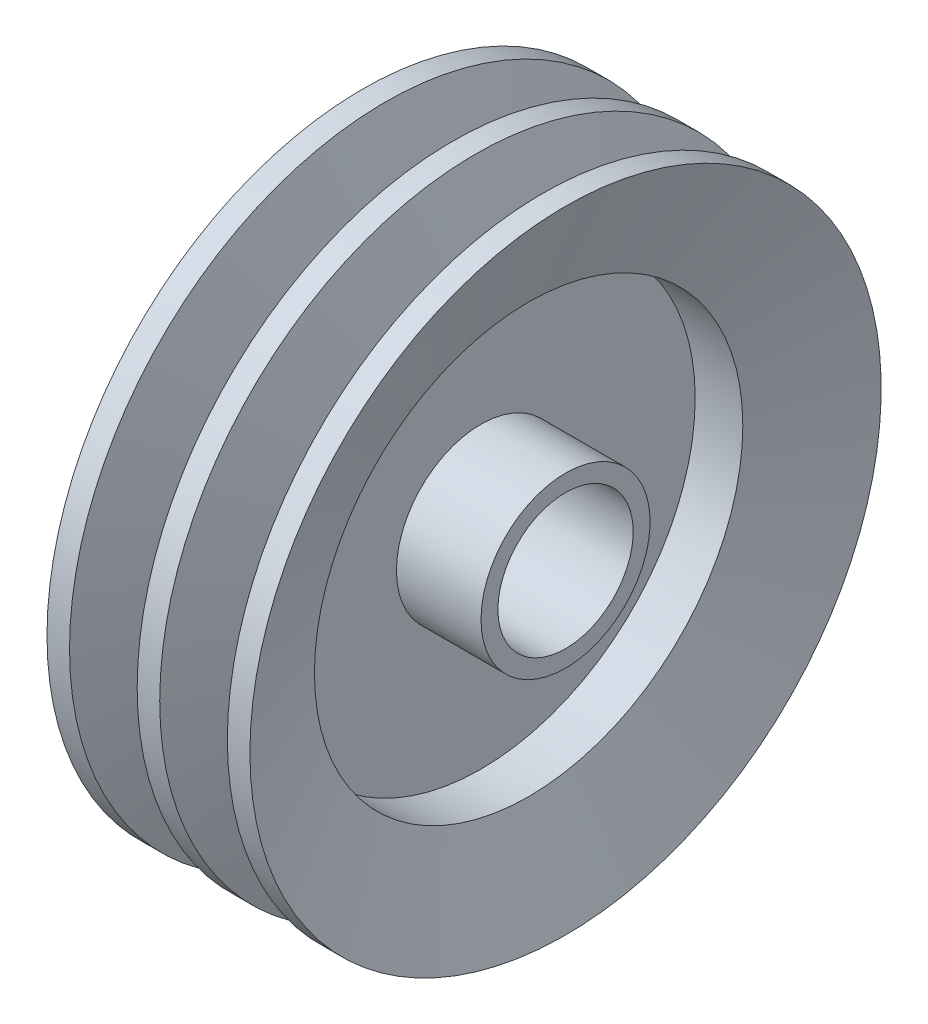
ISO-10303-21;
HEADER;
FILE_DESCRIPTION(('STEP AP214'),'2;1');
FILE_NAME('part.step','',(''),(''),'','','');
FILE_SCHEMA(('AUTOMOTIVE_DESIGN { 1 0 10303 214 1 1 1 1 }'));
ENDSEC;
DATA;
#1=APPLICATION_CONTEXT('core data for automotive mechanical design processes');
#2=APPLICATION_PROTOCOL_DEFINITION('international standard','automotive_design',2000,#1);
#3=PRODUCT_CONTEXT('',#1,'mechanical');
#4=PRODUCT('Part','Part','',(#3));
#5=PRODUCT_RELATED_PRODUCT_CATEGORY('part','',(#4));
#6=PRODUCT_DEFINITION_FORMATION('','',#4);
#7=PRODUCT_DEFINITION_CONTEXT('part definition',#1,'design');
#8=PRODUCT_DEFINITION('design','',#6,#7);
#9=PRODUCT_DEFINITION_SHAPE('','',#8);
#10=(LENGTH_UNIT() NAMED_UNIT(*) SI_UNIT(.MILLI.,.METRE.));
#11=(NAMED_UNIT(*) PLANE_ANGLE_UNIT() SI_UNIT($,.RADIAN.));
#12=(NAMED_UNIT(*) SI_UNIT($,.STERADIAN.) SOLID_ANGLE_UNIT());
#13=UNCERTAINTY_MEASURE_WITH_UNIT(LENGTH_MEASURE(1.E-05),#10,'distance_accuracy_value','');
#14=(GEOMETRIC_REPRESENTATION_CONTEXT(3) GLOBAL_UNCERTAINTY_ASSIGNED_CONTEXT((#13)) GLOBAL_UNIT_ASSIGNED_CONTEXT((#10,
#11,#12)) REPRESENTATION_CONTEXT('',''));
#15=CARTESIAN_POINT('',(0.,0.,0.));
#16=DIRECTION('',(0.,0.,1.));
#17=DIRECTION('',(1.,0.,0.));
#18=AXIS2_PLACEMENT_3D('',#15,#16,#17);
#19=CARTESIAN_POINT('',(-45.,0.,-7.5));
#20=DIRECTION('',(1.,0.,0.));
#21=DIRECTION('',(0.,0.,-1.));
#22=AXIS2_PLACEMENT_3D('',#19,#20,#21);
#23=PLANE('',#22);
#24=CARTESIAN_POINT('',(-45.,0.,30.));
#25=DIRECTION('',(-1.,0.,0.));
#26=DIRECTION('',(0.,0.,1.));
#27=AXIS2_PLACEMENT_3D('',#24,#25,#26);
#28=CIRCLE('',#27,30.);
#29=CARTESIAN_POINT('',(-45.,0.,60.));
#30=VERTEX_POINT('',#29);
#31=EDGE_CURVE('E101',#30,#30,#28,.T.);
#32=ORIENTED_EDGE('',*,*,#31,.F.);
#33=EDGE_LOOP('',(#32));
#34=FACE_BOUND('',#33,.T.);
#35=CARTESIAN_POINT('',(-45.,0.,30.));
#36=DIRECTION('',(-1.,0.,0.));
#37=DIRECTION('',(0.,0.,1.));
#38=AXIS2_PLACEMENT_3D('',#35,#36,#37);
#39=CIRCLE('',#38,37.5);
#40=CARTESIAN_POINT('',(-45.,0.,67.5));
#41=VERTEX_POINT('',#40);
#42=EDGE_CURVE('E10',#41,#41,#39,.T.);
#43=ORIENTED_EDGE('',*,*,#42,.T.);
#44=EDGE_LOOP('',(#43));
#45=FACE_BOUND('',#44,.T.);
#46=ADVANCED_FACE('F37',(#34,#45),#23,.F.);
#47=CARTESIAN_POINT('',(-45.0000000000001,0.,30.));
#48=DIRECTION('',(-1.,0.,0.));
#49=DIRECTION('',(0.,0.,1.));
#50=AXIS2_PLACEMENT_3D('',#47,#48,#49);
#51=CYLINDRICAL_SURFACE('',#50,37.5);
#52=ORIENTED_EDGE('',*,*,#42,.F.);
#53=EDGE_LOOP('',(#52));
#54=FACE_BOUND('',#53,.T.);
#55=CARTESIAN_POINT('',(-7.50000000000001,0.,30.));
#56=DIRECTION('',(-1.,0.,0.));
#57=DIRECTION('',(0.,0.,1.));
#58=AXIS2_PLACEMENT_3D('',#55,#56,#57);
#59=CIRCLE('',#58,37.5);
#60=CARTESIAN_POINT('',(-7.50000000000002,0.,67.5));
#61=VERTEX_POINT('',#60);
#62=EDGE_CURVE('E43',#61,#61,#59,.T.);
#63=ORIENTED_EDGE('',*,*,#62,.T.);
#64=EDGE_LOOP('',(#63));
#65=FACE_BOUND('',#64,.T.);
#66=ADVANCED_FACE('F108',(#54,#65),#51,.T.);
#67=CARTESIAN_POINT('',(-7.5,0.,-65.));
#68=DIRECTION('',(1.,0.,0.));
#69=DIRECTION('',(0.,0.,-1.));
#70=AXIS2_PLACEMENT_3D('',#67,#68,#69);
#71=PLANE('',#70);
#72=ORIENTED_EDGE('',*,*,#62,.F.);
#73=EDGE_LOOP('',(#72));
#74=FACE_BOUND('',#73,.T.);
#75=CARTESIAN_POINT('',(-7.50000000000002,0.,30.));
#76=DIRECTION('',(-1.,0.,0.));
#77=DIRECTION('',(0.,0.,1.));
#78=AXIS2_PLACEMENT_3D('',#75,#76,#77);
#79=CIRCLE('',#78,95.);
#80=CARTESIAN_POINT('',(-7.50000000000004,0.,125.));
#81=VERTEX_POINT('',#80);
#82=EDGE_CURVE('E47',#81,#81,#79,.T.);
#83=ORIENTED_EDGE('',*,*,#82,.T.);
#84=EDGE_LOOP('',(#83));
#85=FACE_BOUND('',#84,.T.);
#86=ADVANCED_FACE('F112',(#74,#85),#71,.F.);
#87=CARTESIAN_POINT('',(-45.0000000000001,0.,30.));
#88=DIRECTION('',(-1.,0.,0.));
#89=DIRECTION('',(0.,0.,1.));
#90=AXIS2_PLACEMENT_3D('',#87,#88,#89);
#91=CYLINDRICAL_SURFACE('',#90,95.);
#92=ORIENTED_EDGE('',*,*,#82,.F.);
#93=EDGE_LOOP('',(#92));
#94=FACE_BOUND('',#93,.T.);
#95=CARTESIAN_POINT('',(-28.621339458021,0.,30.));
#96=DIRECTION('',(-1.,0.,0.));
#97=DIRECTION('',(0.,0.,1.));
#98=AXIS2_PLACEMENT_3D('',#95,#96,#97);
#99=CIRCLE('',#98,95.);
#100=CARTESIAN_POINT('',(-28.621339458021,0.,125.));
#101=VERTEX_POINT('',#100);
#102=EDGE_CURVE('E51',#101,#101,#99,.T.);
#103=ORIENTED_EDGE('',*,*,#102,.T.);
#104=EDGE_LOOP('',(#103));
#105=FACE_BOUND('',#104,.T.);
#106=ADVANCED_FACE('F117',(#94,#105),#91,.F.);
#107=CARTESIAN_POINT('',(-45.,0.,30.));
#108=DIRECTION('',(-1.,0.,0.));
#109=DIRECTION('',(0.,0.,1.));
#110=AXIS2_PLACEMENT_3D('',#107,#108,#109);
#111=CONICAL_SURFACE('',#110,140.,1.22173047639603);
#112=ORIENTED_EDGE('',*,*,#102,.F.);
#113=EDGE_LOOP('',(#112));
#114=FACE_BOUND('',#113,.T.);
#115=CARTESIAN_POINT('',(-45.,0.,30.));
#116=DIRECTION('',(-1.,0.,0.));
#117=DIRECTION('',(0.,0.,1.));
#118=AXIS2_PLACEMENT_3D('',#115,#116,#117);
#119=CIRCLE('',#118,140.);
#120=CARTESIAN_POINT('',(-45.0000000000001,0.,170.));
#121=VERTEX_POINT('',#120);
#122=EDGE_CURVE('E56',#121,#121,#119,.T.);
#123=ORIENTED_EDGE('',*,*,#122,.T.);
#124=EDGE_LOOP('',(#123));
#125=FACE_BOUND('',#124,.T.);
#126=ADVANCED_FACE('F123',(#114,#125),#111,.F.);
#127=CARTESIAN_POINT('',(-45.0000000000001,0.,30.));
#128=DIRECTION('',(-1.,0.,0.));
#129=DIRECTION('',(0.,0.,1.));
#130=AXIS2_PLACEMENT_3D('',#127,#128,#129);
#131=CYLINDRICAL_SURFACE('',#130,140.);
#132=ORIENTED_EDGE('',*,*,#122,.F.);
#133=EDGE_LOOP('',(#132));
#134=FACE_BOUND('',#133,.T.);
#135=CARTESIAN_POINT('',(-35.,0.,30.));
#136=DIRECTION('',(-1.,0.,0.));
#137=DIRECTION('',(0.,0.,1.));
#138=AXIS2_PLACEMENT_3D('',#135,#136,#137);
#139=CIRCLE('',#138,140.);
#140=CARTESIAN_POINT('',(-35.,0.,170.));
#141=VERTEX_POINT('',#140);
#142=EDGE_CURVE('E59',#141,#141,#139,.T.);
#143=ORIENTED_EDGE('',*,*,#142,.T.);
#144=EDGE_LOOP('',(#143));
#145=FACE_BOUND('',#144,.T.);
#146=ADVANCED_FACE('F127',(#134,#145),#131,.T.);
#147=CARTESIAN_POINT('',(-24.0808929720141,0.,30.));
#148=DIRECTION('',(-1.,0.,0.));
#149=DIRECTION('',(0.,0.,1.));
#150=AXIS2_PLACEMENT_3D('',#147,#148,#149);
#151=CONICAL_SURFACE('',#150,110.,1.22173047639603);
#152=ORIENTED_EDGE('',*,*,#142,.F.);
#153=EDGE_LOOP('',(#152));
#154=FACE_BOUND('',#153,.T.);
#155=CARTESIAN_POINT('',(-24.0808929720141,0.,30.));
#156=DIRECTION('',(-1.,0.,0.));
#157=DIRECTION('',(0.,0.,1.));
#158=AXIS2_PLACEMENT_3D('',#155,#156,#157);
#159=CIRCLE('',#158,110.);
#160=CARTESIAN_POINT('',(-24.0808929720141,0.,140.));
#161=VERTEX_POINT('',#160);
#162=EDGE_CURVE('E62',#161,#161,#159,.T.);
#163=ORIENTED_EDGE('',*,*,#162,.T.);
#164=EDGE_LOOP('',(#163));
#165=FACE_BOUND('',#164,.T.);
#166=ADVANCED_FACE('F131',(#154,#165),#151,.T.);
#167=CARTESIAN_POINT('',(-45.0000000000001,0.,30.));
#168=DIRECTION('',(-1.,0.,0.));
#169=DIRECTION('',(0.,0.,1.));
#170=AXIS2_PLACEMENT_3D('',#167,#168,#169);
#171=CYLINDRICAL_SURFACE('',#170,110.);
#172=ORIENTED_EDGE('',*,*,#162,.F.);
#173=EDGE_LOOP('',(#172));
#174=FACE_BOUND('',#173,.T.);
#175=CARTESIAN_POINT('',(-15.919107027986,0.,30.));
#176=DIRECTION('',(-1.,0.,0.));
#177=DIRECTION('',(0.,0.,1.));
#178=AXIS2_PLACEMENT_3D('',#175,#176,#177);
#179=CIRCLE('',#178,110.);
#180=CARTESIAN_POINT('',(-15.919107027986,0.,140.));
#181=VERTEX_POINT('',#180);
#182=EDGE_CURVE('E65',#181,#181,#179,.T.);
#183=ORIENTED_EDGE('',*,*,#182,.T.);
#184=EDGE_LOOP('',(#183));
#185=FACE_BOUND('',#184,.T.);
#186=ADVANCED_FACE('F135',(#174,#185),#171,.T.);
#187=CARTESIAN_POINT('',(-5.00000000000002,0.,30.));
#188=DIRECTION('',(1.,0.,0.));
#189=DIRECTION('',(0.,0.,-1.));
#190=AXIS2_PLACEMENT_3D('',#187,#188,#189);
#191=CONICAL_SURFACE('',#190,140.,1.22173047639603);
#192=ORIENTED_EDGE('',*,*,#182,.F.);
#193=EDGE_LOOP('',(#192));
#194=FACE_BOUND('',#193,.T.);
#195=CARTESIAN_POINT('',(-5.00000000000002,0.,30.));
#196=DIRECTION('',(-1.,0.,0.));
#197=DIRECTION('',(0.,0.,1.));
#198=AXIS2_PLACEMENT_3D('',#195,#196,#197);
#199=CIRCLE('',#198,140.);
#200=CARTESIAN_POINT('',(-5.00000000000005,0.,170.));
#201=VERTEX_POINT('',#200);
#202=EDGE_CURVE('E68',#201,#201,#199,.T.);
#203=ORIENTED_EDGE('',*,*,#202,.T.);
#204=EDGE_LOOP('',(#203));
#205=FACE_BOUND('',#204,.T.);
#206=ADVANCED_FACE('F139',(#194,#205),#191,.T.);
#207=CARTESIAN_POINT('',(-45.0000000000001,0.,30.));
#208=DIRECTION('',(-1.,0.,0.));
#209=DIRECTION('',(0.,0.,1.));
#210=AXIS2_PLACEMENT_3D('',#207,#208,#209);
#211=CYLINDRICAL_SURFACE('',#210,140.);
#212=ORIENTED_EDGE('',*,*,#202,.F.);
#213=EDGE_LOOP('',(#212));
#214=FACE_BOUND('',#213,.T.);
#215=CARTESIAN_POINT('',(4.99999999999997,0.,30.));
#216=DIRECTION('',(-1.,0.,0.));
#217=DIRECTION('',(0.,0.,1.));
#218=AXIS2_PLACEMENT_3D('',#215,#216,#217);
#219=CIRCLE('',#218,140.);
#220=CARTESIAN_POINT('',(4.99999999999994,0.,170.));
#221=VERTEX_POINT('',#220);
#222=EDGE_CURVE('E71',#221,#221,#219,.T.);
#223=ORIENTED_EDGE('',*,*,#222,.T.);
#224=EDGE_LOOP('',(#223));
#225=FACE_BOUND('',#224,.T.);
#226=ADVANCED_FACE('F143',(#214,#225),#211,.T.);
#227=CARTESIAN_POINT('',(15.9191070279859,0.,30.));
#228=DIRECTION('',(-1.,0.,0.));
#229=DIRECTION('',(0.,0.,1.));
#230=AXIS2_PLACEMENT_3D('',#227,#228,#229);
#231=CONICAL_SURFACE('',#230,110.,1.22173047639603);
#232=ORIENTED_EDGE('',*,*,#222,.F.);
#233=EDGE_LOOP('',(#232));
#234=FACE_BOUND('',#233,.T.);
#235=CARTESIAN_POINT('',(15.9191070279859,0.,30.));
#236=DIRECTION('',(-1.,0.,0.));
#237=DIRECTION('',(0.,0.,1.));
#238=AXIS2_PLACEMENT_3D('',#235,#236,#237);
#239=CIRCLE('',#238,110.);
#240=CARTESIAN_POINT('',(15.9191070279859,0.,140.));
#241=VERTEX_POINT('',#240);
#242=EDGE_CURVE('E74',#241,#241,#239,.T.);
#243=ORIENTED_EDGE('',*,*,#242,.T.);
#244=EDGE_LOOP('',(#243));
#245=FACE_BOUND('',#244,.T.);
#246=ADVANCED_FACE('F147',(#234,#245),#231,.T.);
#247=CARTESIAN_POINT('',(-45.0000000000001,0.,30.));
#248=DIRECTION('',(-1.,0.,0.));
#249=DIRECTION('',(0.,0.,1.));
#250=AXIS2_PLACEMENT_3D('',#247,#248,#249);
#251=CYLINDRICAL_SURFACE('',#250,110.);
#252=ORIENTED_EDGE('',*,*,#242,.F.);
#253=EDGE_LOOP('',(#252));
#254=FACE_BOUND('',#253,.T.);
#255=CARTESIAN_POINT('',(24.080892972014,0.,30.));
#256=DIRECTION('',(-1.,0.,0.));
#257=DIRECTION('',(0.,0.,1.));
#258=AXIS2_PLACEMENT_3D('',#255,#256,#257);
#259=CIRCLE('',#258,110.);
#260=CARTESIAN_POINT('',(24.080892972014,0.,140.));
#261=VERTEX_POINT('',#260);
#262=EDGE_CURVE('E77',#261,#261,#259,.T.);
#263=ORIENTED_EDGE('',*,*,#262,.T.);
#264=EDGE_LOOP('',(#263));
#265=FACE_BOUND('',#264,.T.);
#266=ADVANCED_FACE('F151',(#254,#265),#251,.T.);
#267=CARTESIAN_POINT('',(35.,0.,30.));
#268=DIRECTION('',(1.,0.,0.));
#269=DIRECTION('',(0.,0.,-1.));
#270=AXIS2_PLACEMENT_3D('',#267,#268,#269);
#271=CONICAL_SURFACE('',#270,140.,1.22173047639603);
#272=ORIENTED_EDGE('',*,*,#262,.F.);
#273=EDGE_LOOP('',(#272));
#274=FACE_BOUND('',#273,.T.);
#275=CARTESIAN_POINT('',(35.,0.,30.));
#276=DIRECTION('',(-1.,0.,0.));
#277=DIRECTION('',(0.,0.,1.));
#278=AXIS2_PLACEMENT_3D('',#275,#276,#277);
#279=CIRCLE('',#278,140.);
#280=CARTESIAN_POINT('',(34.9999999999999,0.,170.));
#281=VERTEX_POINT('',#280);
#282=EDGE_CURVE('E80',#281,#281,#279,.T.);
#283=ORIENTED_EDGE('',*,*,#282,.T.);
#284=EDGE_LOOP('',(#283));
#285=FACE_BOUND('',#284,.T.);
#286=ADVANCED_FACE('F155',(#274,#285),#271,.T.);
#287=CARTESIAN_POINT('',(-45.0000000000001,0.,30.));
#288=DIRECTION('',(-1.,0.,0.));
#289=DIRECTION('',(0.,0.,1.));
#290=AXIS2_PLACEMENT_3D('',#287,#288,#289);
#291=CYLINDRICAL_SURFACE('',#290,140.);
#292=ORIENTED_EDGE('',*,*,#282,.F.);
#293=EDGE_LOOP('',(#292));
#294=FACE_BOUND('',#293,.T.);
#295=CARTESIAN_POINT('',(45.,0.,30.));
#296=DIRECTION('',(-1.,0.,0.));
#297=DIRECTION('',(0.,0.,1.));
#298=AXIS2_PLACEMENT_3D('',#295,#296,#297);
#299=CIRCLE('',#298,140.);
#300=CARTESIAN_POINT('',(44.9999999999999,0.,170.));
#301=VERTEX_POINT('',#300);
#302=EDGE_CURVE('E83',#301,#301,#299,.T.);
#303=ORIENTED_EDGE('',*,*,#302,.T.);
#304=EDGE_LOOP('',(#303));
#305=FACE_BOUND('',#304,.T.);
#306=ADVANCED_FACE('F159',(#294,#305),#291,.T.);
#307=CARTESIAN_POINT('',(28.621339458021,0.,30.));
#308=DIRECTION('',(1.,0.,0.));
#309=DIRECTION('',(0.,0.,-1.));
#310=AXIS2_PLACEMENT_3D('',#307,#308,#309);
#311=CONICAL_SURFACE('',#310,95.,1.22173047639603);
#312=ORIENTED_EDGE('',*,*,#302,.F.);
#313=EDGE_LOOP('',(#312));
#314=FACE_BOUND('',#313,.T.);
#315=CARTESIAN_POINT('',(28.621339458021,0.,30.));
#316=DIRECTION('',(-1.,0.,0.));
#317=DIRECTION('',(0.,0.,1.));
#318=AXIS2_PLACEMENT_3D('',#315,#316,#317);
#319=CIRCLE('',#318,95.);
#320=CARTESIAN_POINT('',(28.621339458021,0.,125.));
#321=VERTEX_POINT('',#320);
#322=EDGE_CURVE('E86',#321,#321,#319,.T.);
#323=ORIENTED_EDGE('',*,*,#322,.T.);
#324=EDGE_LOOP('',(#323));
#325=FACE_BOUND('',#324,.T.);
#326=ADVANCED_FACE('F163',(#314,#325),#311,.F.);
#327=CARTESIAN_POINT('',(-45.0000000000001,0.,30.));
#328=DIRECTION('',(-1.,0.,0.));
#329=DIRECTION('',(0.,0.,1.));
#330=AXIS2_PLACEMENT_3D('',#327,#328,#329);
#331=CYLINDRICAL_SURFACE('',#330,95.);
#332=ORIENTED_EDGE('',*,*,#322,.F.);
#333=EDGE_LOOP('',(#332));
#334=FACE_BOUND('',#333,.T.);
#335=CARTESIAN_POINT('',(7.49999999999998,0.,30.));
#336=DIRECTION('',(-1.,0.,0.));
#337=DIRECTION('',(0.,0.,1.));
#338=AXIS2_PLACEMENT_3D('',#335,#336,#337);
#339=CIRCLE('',#338,95.);
#340=CARTESIAN_POINT('',(7.49999999999996,0.,125.));
#341=VERTEX_POINT('',#340);
#342=EDGE_CURVE('E89',#341,#341,#339,.T.);
#343=ORIENTED_EDGE('',*,*,#342,.T.);
#344=EDGE_LOOP('',(#343));
#345=FACE_BOUND('',#344,.T.);
#346=ADVANCED_FACE('F167',(#334,#345),#331,.F.);
#347=CARTESIAN_POINT('',(7.50000000000001,0.,-65.));
#348=DIRECTION('',(-1.,0.,0.));
#349=DIRECTION('',(0.,0.,1.));
#350=AXIS2_PLACEMENT_3D('',#347,#348,#349);
#351=PLANE('',#350);
#352=ORIENTED_EDGE('',*,*,#342,.F.);
#353=EDGE_LOOP('',(#352));
#354=FACE_BOUND('',#353,.T.);
#355=CARTESIAN_POINT('',(7.5,0.,30.));
#356=DIRECTION('',(-1.,0.,0.));
#357=DIRECTION('',(0.,0.,1.));
#358=AXIS2_PLACEMENT_3D('',#355,#356,#357);
#359=CIRCLE('',#358,37.5);
#360=CARTESIAN_POINT('',(7.49999999999999,0.,67.5));
#361=VERTEX_POINT('',#360);
#362=EDGE_CURVE('E92',#361,#361,#359,.T.);
#363=ORIENTED_EDGE('',*,*,#362,.T.);
#364=EDGE_LOOP('',(#363));
#365=FACE_BOUND('',#364,.T.);
#366=ADVANCED_FACE('F171',(#354,#365),#351,.F.);
#367=CARTESIAN_POINT('',(-45.0000000000001,0.,30.));
#368=DIRECTION('',(-1.,0.,0.));
#369=DIRECTION('',(0.,0.,1.));
#370=AXIS2_PLACEMENT_3D('',#367,#368,#369);
#371=CYLINDRICAL_SURFACE('',#370,37.5);
#372=ORIENTED_EDGE('',*,*,#362,.F.);
#373=EDGE_LOOP('',(#372));
#374=FACE_BOUND('',#373,.T.);
#375=CARTESIAN_POINT('',(45.,0.,30.));
#376=DIRECTION('',(-1.,0.,0.));
#377=DIRECTION('',(0.,0.,1.));
#378=AXIS2_PLACEMENT_3D('',#375,#376,#377);
#379=CIRCLE('',#378,37.5);
#380=CARTESIAN_POINT('',(45.,0.,67.5));
#381=VERTEX_POINT('',#380);
#382=EDGE_CURVE('E95',#381,#381,#379,.T.);
#383=ORIENTED_EDGE('',*,*,#382,.T.);
#384=EDGE_LOOP('',(#383));
#385=FACE_BOUND('',#384,.T.);
#386=ADVANCED_FACE('F175',(#374,#385),#371,.T.);
#387=CARTESIAN_POINT('',(45.,0.,-7.5));
#388=DIRECTION('',(-1.,0.,0.));
#389=DIRECTION('',(0.,0.,1.));
#390=AXIS2_PLACEMENT_3D('',#387,#388,#389);
#391=PLANE('',#390);
#392=ORIENTED_EDGE('',*,*,#382,.F.);
#393=EDGE_LOOP('',(#392));
#394=FACE_BOUND('',#393,.T.);
#395=CARTESIAN_POINT('',(45.,0.,30.));
#396=DIRECTION('',(-1.,0.,0.));
#397=DIRECTION('',(0.,0.,1.));
#398=AXIS2_PLACEMENT_3D('',#395,#396,#397);
#399=CIRCLE('',#398,30.);
#400=CARTESIAN_POINT('',(45.,0.,60.));
#401=VERTEX_POINT('',#400);
#402=EDGE_CURVE('E98',#401,#401,#399,.T.);
#403=ORIENTED_EDGE('',*,*,#402,.T.);
#404=EDGE_LOOP('',(#403));
#405=FACE_BOUND('',#404,.T.);
#406=ADVANCED_FACE('F179',(#394,#405),#391,.F.);
#407=CARTESIAN_POINT('',(-45.0000000000001,0.,30.));
#408=DIRECTION('',(-1.,0.,0.));
#409=DIRECTION('',(0.,0.,1.));
#410=AXIS2_PLACEMENT_3D('',#407,#408,#409);
#411=CYLINDRICAL_SURFACE('',#410,30.);
#412=ORIENTED_EDGE('',*,*,#402,.F.);
#413=EDGE_LOOP('',(#412));
#414=FACE_BOUND('',#413,.T.);
#415=ORIENTED_EDGE('',*,*,#31,.T.);
#416=EDGE_LOOP('',(#415));
#417=FACE_BOUND('',#416,.T.);
#418=ADVANCED_FACE('F105',(#414,#417),#411,.F.);
#419=CLOSED_SHELL('',(#46,#66,#86,#106,#126,#146,#166,#186,#206,#226,#246,#266,#286,#306,#326,
#346,#366,#386,#406,#418));
#420=MANIFOLD_SOLID_BREP('B2',#419);
#421=ADVANCED_BREP_SHAPE_REPRESENTATION('',(#18,#420),#14);
#422=SHAPE_DEFINITION_REPRESENTATION(#9,#421);
ENDSEC;
END-ISO-10303-21;
